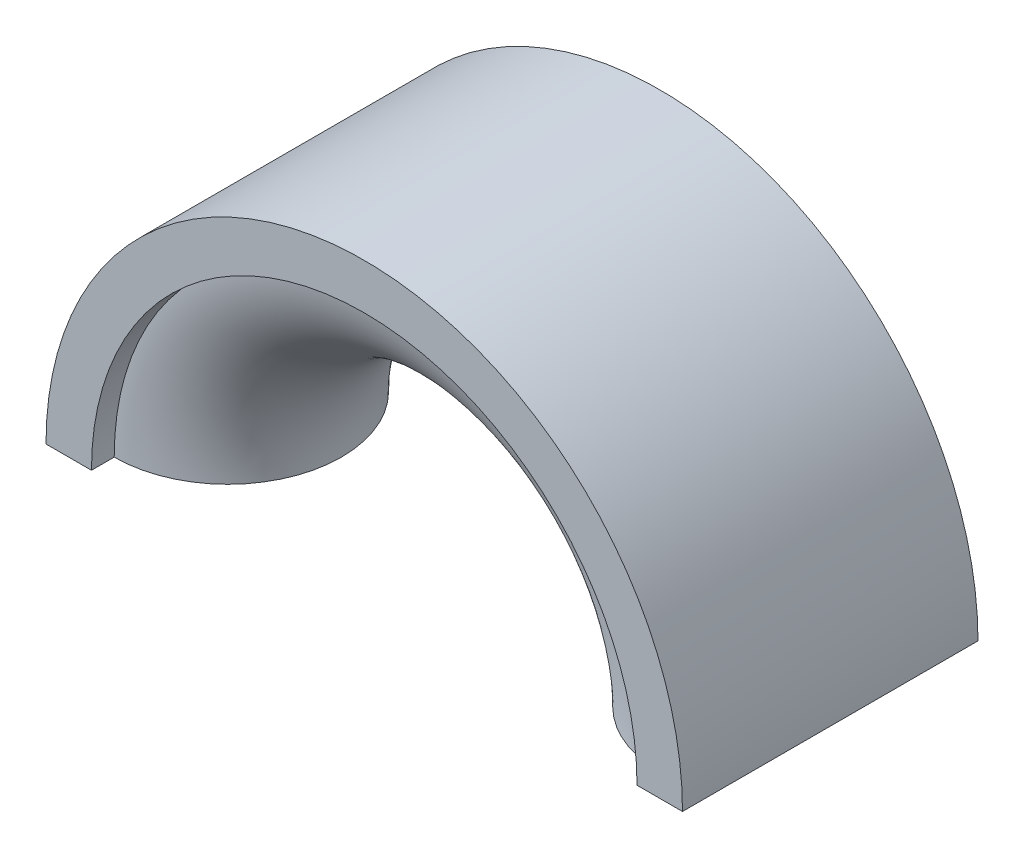
ISO-10303-21;
HEADER;
FILE_DESCRIPTION(('STEP AP214'),'2;1');
FILE_NAME('part.step','',(''),(''),'','','');
FILE_SCHEMA(('AUTOMOTIVE_DESIGN { 1 0 10303 214 1 1 1 1 }'));
ENDSEC;
DATA;
#1=APPLICATION_CONTEXT('core data for automotive mechanical design processes');
#2=APPLICATION_PROTOCOL_DEFINITION('international standard','automotive_design',2000,#1);
#3=PRODUCT_CONTEXT('',#1,'mechanical');
#4=PRODUCT('Part','Part','',(#3));
#5=PRODUCT_RELATED_PRODUCT_CATEGORY('part','',(#4));
#6=PRODUCT_DEFINITION_FORMATION('','',#4);
#7=PRODUCT_DEFINITION_CONTEXT('part definition',#1,'design');
#8=PRODUCT_DEFINITION('design','',#6,#7);
#9=PRODUCT_DEFINITION_SHAPE('','',#8);
#10=(LENGTH_UNIT() NAMED_UNIT(*) SI_UNIT(.MILLI.,.METRE.));
#11=(NAMED_UNIT(*) PLANE_ANGLE_UNIT() SI_UNIT($,.RADIAN.));
#12=(NAMED_UNIT(*) SI_UNIT($,.STERADIAN.) SOLID_ANGLE_UNIT());
#13=UNCERTAINTY_MEASURE_WITH_UNIT(LENGTH_MEASURE(1.E-05),#10,'distance_accuracy_value','');
#14=(GEOMETRIC_REPRESENTATION_CONTEXT(3) GLOBAL_UNCERTAINTY_ASSIGNED_CONTEXT((#13)) GLOBAL_UNIT_ASSIGNED_CONTEXT((#10,
#11,#12)) REPRESENTATION_CONTEXT('',''));
#15=CARTESIAN_POINT('',(0.,0.,0.));
#16=DIRECTION('',(0.,0.,1.));
#17=DIRECTION('',(1.,0.,0.));
#18=AXIS2_PLACEMENT_3D('',#15,#16,#17);
#19=CARTESIAN_POINT('',(0.,0.,0.));
#20=DIRECTION('',(0.,1.,0.));
#21=DIRECTION('',(0.,0.,1.));
#22=AXIS2_PLACEMENT_3D('',#19,#20,#21);
#23=PLANE('',#22);
#24=CARTESIAN_POINT('',(9.99999999999999,0.,5.99999999999991));
#25=DIRECTION('',(0.,-1.,0.));
#26=DIRECTION('',(0.,0.,-1.));
#27=AXIS2_PLACEMENT_3D('',#24,#25,#26);
#28=CIRCLE('',#27,1.35);
#29=CARTESIAN_POINT('',(9.99999999999999,0.,4.64999999999991));
#30=VERTEX_POINT('',#29);
#31=EDGE_CURVE('E342',#30,#30,#28,.T.);
#32=ORIENTED_EDGE('',*,*,#31,.F.);
#33=EDGE_LOOP('',(#32));
#34=FACE_BOUND('',#33,.T.);
#35=DIRECTION('',(0.,0.,-1.));
#36=VECTOR('',#35,1.);
#37=CARTESIAN_POINT('',(4.05,0.,10.));
#38=LINE('',#37,#36);
#39=CARTESIAN_POINT('',(4.05,0.,-0.999999999999999));
#40=VERTEX_POINT('',#39);
#41=CARTESIAN_POINT('',(4.05,0.,0.));
#42=VERTEX_POINT('',#41);
#43=EDGE_CURVE('E11',#40,#42,#38,.F.);
#44=ORIENTED_EDGE('',*,*,#43,.F.);
#45=DIRECTION('',(1.,0.,0.));
#46=VECTOR('',#45,1.);
#47=CARTESIAN_POINT('',(-12.,0.,-1.));
#48=LINE('',#47,#46);
#49=CARTESIAN_POINT('',(14.,0.,-1.));
#50=VERTEX_POINT('',#49);
#51=EDGE_CURVE('E68',#40,#50,#48,.T.);
#52=ORIENTED_EDGE('',*,*,#51,.T.);
#53=DIRECTION('',(0.,0.,-1.));
#54=VECTOR('',#53,1.);
#55=CARTESIAN_POINT('',(14.,0.,0.));
#56=LINE('',#55,#54);
#57=CARTESIAN_POINT('',(14.,0.,12.));
#58=VERTEX_POINT('',#57);
#59=EDGE_CURVE('E135',#50,#58,#56,.F.);
#60=ORIENTED_EDGE('',*,*,#59,.T.);
#61=DIRECTION('',(-1.,0.,0.));
#62=VECTOR('',#61,1.);
#63=CARTESIAN_POINT('',(-12.,0.,12.));
#64=LINE('',#63,#62);
#65=CARTESIAN_POINT('',(12.,0.,12.));
#66=VERTEX_POINT('',#65);
#67=EDGE_CURVE('E193',#58,#66,#64,.T.);
#68=ORIENTED_EDGE('',*,*,#67,.T.);
#69=DIRECTION('',(0.,0.,-1.));
#70=VECTOR('',#69,1.);
#71=CARTESIAN_POINT('',(12.,0.,0.));
#72=LINE('',#71,#70);
#73=CARTESIAN_POINT('',(12.0000000000001,0.,10.9999999999999));
#74=VERTEX_POINT('',#73);
#75=EDGE_CURVE('E188',#66,#74,#72,.T.);
#76=ORIENTED_EDGE('',*,*,#75,.T.);
#77=CARTESIAN_POINT('',(12.,0.,5.99999999999991));
#78=DIRECTION('',(0.,1.,0.));
#79=DIRECTION('',(0.,0.,1.));
#80=AXIS2_PLACEMENT_3D('',#77,#78,#79);
#81=CIRCLE('',#80,5.);
#82=CARTESIAN_POINT('',(12.,0.,0.999999999999957));
#83=VERTEX_POINT('',#82);
#84=EDGE_CURVE('E175',#74,#83,#81,.F.);
#85=ORIENTED_EDGE('',*,*,#84,.T.);
#86=DIRECTION('',(0.,0.,-1.));
#87=VECTOR('',#86,1.);
#88=CARTESIAN_POINT('',(12.,0.,0.));
#89=LINE('',#88,#87);
#90=CARTESIAN_POINT('',(12.,0.,0.));
#91=VERTEX_POINT('',#90);
#92=EDGE_CURVE('E167',#83,#91,#89,.T.);
#93=ORIENTED_EDGE('',*,*,#92,.T.);
#94=DIRECTION('',(-1.,0.,0.));
#95=VECTOR('',#94,1.);
#96=CARTESIAN_POINT('',(0.,0.,0.));
#97=LINE('',#96,#95);
#98=EDGE_CURVE('E162',#91,#42,#97,.T.);
#99=ORIENTED_EDGE('',*,*,#98,.T.);
#100=EDGE_LOOP('',(#44,#52,#60,#68,#76,#85,#93,#99));
#101=FACE_BOUND('',#100,.T.);
#102=ADVANCED_FACE('F45',(#34,#101),#23,.F.);
#103=CARTESIAN_POINT('',(-9.99999999999999,0.,5.99999999999991));
#104=DIRECTION('',(0.,-1.,0.));
#105=DIRECTION('',(0.,0.,-1.));
#106=AXIS2_PLACEMENT_3D('',#103,#104,#105);
#107=CIRCLE('',#106,1.35);
#108=CARTESIAN_POINT('',(-9.99999999999999,0.,4.64999999999991));
#109=VERTEX_POINT('',#108);
#110=EDGE_CURVE('E346',#109,#109,#107,.T.);
#111=ORIENTED_EDGE('',*,*,#110,.F.);
#112=EDGE_LOOP('',(#111));
#113=FACE_BOUND('',#112,.T.);
#114=DIRECTION('',(0.,0.,-1.));
#115=VECTOR('',#114,1.);
#116=CARTESIAN_POINT('',(-4.05,0.,10.));
#117=LINE('',#116,#115);
#118=CARTESIAN_POINT('',(-4.05,0.,0.));
#119=VERTEX_POINT('',#118);
#120=CARTESIAN_POINT('',(-4.05,0.,-1.));
#121=VERTEX_POINT('',#120);
#122=EDGE_CURVE('E54',#119,#121,#117,.T.);
#123=ORIENTED_EDGE('',*,*,#122,.F.);
#124=CARTESIAN_POINT('',(-12.,0.,0.));
#125=VERTEX_POINT('',#124);
#126=EDGE_CURVE('E160',#119,#125,#97,.T.);
#127=ORIENTED_EDGE('',*,*,#126,.T.);
#128=DIRECTION('',(0.,0.,-1.));
#129=VECTOR('',#128,1.);
#130=CARTESIAN_POINT('',(-12.,0.,0.));
#131=LINE('',#130,#129);
#132=CARTESIAN_POINT('',(-12.,0.,0.999999999999957));
#133=VERTEX_POINT('',#132);
#134=EDGE_CURVE('E169',#125,#133,#131,.F.);
#135=ORIENTED_EDGE('',*,*,#134,.T.);
#136=CARTESIAN_POINT('',(-12.,0.,6.00000000000008));
#137=DIRECTION('',(0.,1.,0.));
#138=DIRECTION('',(0.,0.,1.));
#139=AXIS2_PLACEMENT_3D('',#136,#137,#138);
#140=CIRCLE('',#139,5.);
#141=CARTESIAN_POINT('',(-11.9999999999999,0.,11.0000000000001));
#142=VERTEX_POINT('',#141);
#143=EDGE_CURVE('E182',#133,#142,#140,.F.);
#144=ORIENTED_EDGE('',*,*,#143,.T.);
#145=DIRECTION('',(0.,0.,-1.));
#146=VECTOR('',#145,1.);
#147=CARTESIAN_POINT('',(-12.,0.,0.));
#148=LINE('',#147,#146);
#149=CARTESIAN_POINT('',(-12.,0.,12.));
#150=VERTEX_POINT('',#149);
#151=EDGE_CURVE('E185',#142,#150,#148,.F.);
#152=ORIENTED_EDGE('',*,*,#151,.T.);
#153=CARTESIAN_POINT('',(-14.,0.,12.));
#154=VERTEX_POINT('',#153);
#155=EDGE_CURVE('E191',#150,#154,#64,.T.);
#156=ORIENTED_EDGE('',*,*,#155,.T.);
#157=DIRECTION('',(0.,0.,-1.));
#158=VECTOR('',#157,1.);
#159=CARTESIAN_POINT('',(-14.,0.,0.));
#160=LINE('',#159,#158);
#161=CARTESIAN_POINT('',(-14.,0.,-1.));
#162=VERTEX_POINT('',#161);
#163=EDGE_CURVE('E127',#154,#162,#160,.T.);
#164=ORIENTED_EDGE('',*,*,#163,.T.);
#165=EDGE_CURVE('E120',#162,#121,#48,.T.);
#166=ORIENTED_EDGE('',*,*,#165,.T.);
#167=EDGE_LOOP('',(#123,#127,#135,#144,#152,#156,#164,#166));
#168=FACE_BOUND('',#167,.T.);
#169=ADVANCED_FACE('F125',(#113,#168),#23,.F.);
#170=CARTESIAN_POINT('',(0.,0.,6.));
#171=DIRECTION('',(0.,0.,1.));
#172=DIRECTION('',(0.,-1.,0.));
#173=AXIS2_PLACEMENT_3D('',#170,#171,#172);
#174=TOROIDAL_SURFACE('',#173,12.,5.);
#175=ORIENTED_EDGE('',*,*,#143,.F.);
#176=CARTESIAN_POINT('',(0.,0.,0.999999999999999));
#177=DIRECTION('',(0.,0.,1.));
#178=DIRECTION('',(0.,-1.,0.));
#179=AXIS2_PLACEMENT_3D('',#176,#177,#178);
#180=CIRCLE('',#179,12.);
#181=EDGE_CURVE('E150',#83,#133,#180,.T.);
#182=ORIENTED_EDGE('',*,*,#181,.F.);
#183=ORIENTED_EDGE('',*,*,#84,.F.);
#184=CARTESIAN_POINT('',(0.,0.,11.));
#185=DIRECTION('',(0.,0.,-1.));
#186=DIRECTION('',(-1.,0.,0.));
#187=AXIS2_PLACEMENT_3D('',#184,#185,#186);
#188=CIRCLE('',#187,12.);
#189=EDGE_CURVE('E146',#142,#74,#188,.T.);
#190=ORIENTED_EDGE('',*,*,#189,.F.);
#191=EDGE_LOOP('',(#175,#182,#183,#190));
#192=FACE_BOUND('',#191,.T.);
#193=ADVANCED_FACE('F47',(#192),#174,.T.);
#194=CARTESIAN_POINT('',(0.,0.,0.));
#195=DIRECTION('',(0.,0.,-1.));
#196=DIRECTION('',(-1.,0.,0.));
#197=AXIS2_PLACEMENT_3D('',#194,#195,#196);
#198=CYLINDRICAL_SURFACE('',#197,12.);
#199=ORIENTED_EDGE('',*,*,#75,.F.);
#200=CARTESIAN_POINT('',(0.,0.,12.));
#201=DIRECTION('',(0.,0.,-1.));
#202=DIRECTION('',(-1.,0.,0.));
#203=AXIS2_PLACEMENT_3D('',#200,#201,#202);
#204=CIRCLE('',#203,12.);
#205=EDGE_CURVE('E142',#150,#66,#204,.T.);
#206=ORIENTED_EDGE('',*,*,#205,.F.);
#207=ORIENTED_EDGE('',*,*,#151,.F.);
#208=ORIENTED_EDGE('',*,*,#189,.T.);
#209=EDGE_LOOP('',(#199,#206,#207,#208));
#210=FACE_BOUND('',#209,.T.);
#211=ADVANCED_FACE('F204',(#210),#198,.F.);
#212=ORIENTED_EDGE('',*,*,#92,.F.);
#213=ORIENTED_EDGE('',*,*,#181,.T.);
#214=ORIENTED_EDGE('',*,*,#134,.F.);
#215=CARTESIAN_POINT('',(0.,0.,0.));
#216=DIRECTION('',(0.,0.,1.));
#217=DIRECTION('',(1.,0.,0.));
#218=AXIS2_PLACEMENT_3D('',#215,#216,#217);
#219=CIRCLE('',#218,12.);
#220=EDGE_CURVE('E115',#91,#125,#219,.T.);
#221=ORIENTED_EDGE('',*,*,#220,.F.);
#222=EDGE_LOOP('',(#212,#213,#214,#221));
#223=FACE_BOUND('',#222,.T.);
#224=ADVANCED_FACE('F166',(#223),#198,.F.);
#225=CARTESIAN_POINT('',(-12.,0.,12.));
#226=DIRECTION('',(0.,0.,1.));
#227=DIRECTION('',(1.,0.,0.));
#228=AXIS2_PLACEMENT_3D('',#225,#226,#227);
#229=PLANE('',#228);
#230=ORIENTED_EDGE('',*,*,#67,.F.);
#231=CARTESIAN_POINT('',(0.,0.,12.));
#232=DIRECTION('',(0.,0.,-1.));
#233=DIRECTION('',(-1.,0.,0.));
#234=AXIS2_PLACEMENT_3D('',#231,#232,#233);
#235=CIRCLE('',#234,14.);
#236=EDGE_CURVE('E133',#154,#58,#235,.T.);
#237=ORIENTED_EDGE('',*,*,#236,.F.);
#238=ORIENTED_EDGE('',*,*,#155,.F.);
#239=ORIENTED_EDGE('',*,*,#205,.T.);
#240=EDGE_LOOP('',(#230,#237,#238,#239));
#241=FACE_BOUND('',#240,.T.);
#242=ADVANCED_FACE('F208',(#241),#229,.T.);
#243=CARTESIAN_POINT('',(0.,0.,0.));
#244=DIRECTION('',(0.,0.,-1.));
#245=DIRECTION('',(-1.,0.,0.));
#246=AXIS2_PLACEMENT_3D('',#243,#244,#245);
#247=CYLINDRICAL_SURFACE('',#246,14.);
#248=ORIENTED_EDGE('',*,*,#59,.F.);
#249=CARTESIAN_POINT('',(0.,0.,-1.));
#250=DIRECTION('',(0.,0.,-1.));
#251=DIRECTION('',(-1.,0.,0.));
#252=AXIS2_PLACEMENT_3D('',#249,#250,#251);
#253=CIRCLE('',#252,14.);
#254=EDGE_CURVE('E129',#162,#50,#253,.T.);
#255=ORIENTED_EDGE('',*,*,#254,.F.);
#256=ORIENTED_EDGE('',*,*,#163,.F.);
#257=ORIENTED_EDGE('',*,*,#236,.T.);
#258=EDGE_LOOP('',(#248,#255,#256,#257));
#259=FACE_BOUND('',#258,.T.);
#260=ADVANCED_FACE('F210',(#259),#247,.T.);
#261=CARTESIAN_POINT('',(-12.,0.,-1.));
#262=DIRECTION('',(0.,0.,-1.));
#263=DIRECTION('',(-1.,0.,0.));
#264=AXIS2_PLACEMENT_3D('',#261,#262,#263);
#265=PLANE('',#264);
#266=ORIENTED_EDGE('',*,*,#51,.F.);
#267=CARTESIAN_POINT('',(0.,0.,-0.999999999999999));
#268=DIRECTION('',(0.,0.,-1.));
#269=DIRECTION('',(-1.,0.,0.));
#270=AXIS2_PLACEMENT_3D('',#267,#268,#269);
#271=CIRCLE('',#270,4.05);
#272=EDGE_CURVE('E110',#40,#121,#271,.F.);
#273=ORIENTED_EDGE('',*,*,#272,.T.);
#274=ORIENTED_EDGE('',*,*,#165,.F.);
#275=ORIENTED_EDGE('',*,*,#254,.T.);
#276=EDGE_LOOP('',(#266,#273,#274,#275));
#277=FACE_BOUND('',#276,.T.);
#278=ADVANCED_FACE('F118',(#277),#265,.T.);
#279=CARTESIAN_POINT('',(0.,0.,0.));
#280=DIRECTION('',(0.,0.,1.));
#281=DIRECTION('',(1.,0.,0.));
#282=AXIS2_PLACEMENT_3D('',#279,#280,#281);
#283=PLANE('',#282);
#284=ORIENTED_EDGE('',*,*,#126,.F.);
#285=CARTESIAN_POINT('',(0.,0.,0.));
#286=DIRECTION('',(0.,0.,1.));
#287=DIRECTION('',(1.,0.,0.));
#288=AXIS2_PLACEMENT_3D('',#285,#286,#287);
#289=CIRCLE('',#288,4.05);
#290=EDGE_CURVE('E60',#119,#42,#289,.F.);
#291=ORIENTED_EDGE('',*,*,#290,.T.);
#292=ORIENTED_EDGE('',*,*,#98,.F.);
#293=ORIENTED_EDGE('',*,*,#220,.T.);
#294=EDGE_LOOP('',(#284,#291,#292,#293));
#295=FACE_BOUND('',#294,.T.);
#296=ADVANCED_FACE('F159',(#295),#283,.T.);
#297=CARTESIAN_POINT('',(-9.99999999999999,2.,5.99999999999991));
#298=DIRECTION('',(0.,-1.,0.));
#299=DIRECTION('',(0.,0.,-1.));
#300=AXIS2_PLACEMENT_3D('',#297,#298,#299);
#301=CYLINDRICAL_SURFACE('',#300,1.35);
#302=CARTESIAN_POINT('',(-9.99999999999999,2.,5.99999999999991));
#303=DIRECTION('',(0.,-1.,0.));
#304=DIRECTION('',(0.,0.,-1.));
#305=AXIS2_PLACEMENT_3D('',#302,#303,#304);
#306=CIRCLE('',#305,1.35);
#307=CARTESIAN_POINT('',(-9.99999999999999,2.,4.64999999999991));
#308=VERTEX_POINT('',#307);
#309=EDGE_CURVE('E123',#308,#308,#306,.T.);
#310=ORIENTED_EDGE('',*,*,#309,.F.);
#311=EDGE_LOOP('',(#310));
#312=FACE_BOUND('',#311,.T.);
#313=ORIENTED_EDGE('',*,*,#110,.T.);
#314=EDGE_LOOP('',(#313));
#315=FACE_BOUND('',#314,.T.);
#316=ADVANCED_FACE('F234',(#312,#315),#301,.F.);
#317=CARTESIAN_POINT('',(-9.99999999999999,2.,5.99999999999991));
#318=DIRECTION('',(0.,-1.,0.));
#319=DIRECTION('',(0.,0.,-1.));
#320=AXIS2_PLACEMENT_3D('',#317,#318,#319);
#321=PLANE('',#320);
#322=ORIENTED_EDGE('',*,*,#309,.T.);
#323=EDGE_LOOP('',(#322));
#324=FACE_BOUND('',#323,.T.);
#325=ADVANCED_FACE('F231',(#324),#321,.T.);
#326=CARTESIAN_POINT('',(9.99999999999999,2.,5.99999999999991));
#327=DIRECTION('',(0.,-1.,0.));
#328=DIRECTION('',(0.,0.,-1.));
#329=AXIS2_PLACEMENT_3D('',#326,#327,#328);
#330=CYLINDRICAL_SURFACE('',#329,1.35);
#331=CARTESIAN_POINT('',(9.99999999999999,2.,5.99999999999991));
#332=DIRECTION('',(0.,-1.,0.));
#333=DIRECTION('',(0.,0.,-1.));
#334=AXIS2_PLACEMENT_3D('',#331,#332,#333);
#335=CIRCLE('',#334,1.35);
#336=CARTESIAN_POINT('',(9.99999999999999,2.,4.64999999999991));
#337=VERTEX_POINT('',#336);
#338=EDGE_CURVE('E338',#337,#337,#335,.T.);
#339=ORIENTED_EDGE('',*,*,#338,.F.);
#340=EDGE_LOOP('',(#339));
#341=FACE_BOUND('',#340,.T.);
#342=ORIENTED_EDGE('',*,*,#31,.T.);
#343=EDGE_LOOP('',(#342));
#344=FACE_BOUND('',#343,.T.);
#345=ADVANCED_FACE('F242',(#341,#344),#330,.F.);
#346=CARTESIAN_POINT('',(0.,2.,0.));
#347=DIRECTION('',(0.,-1.,0.));
#348=DIRECTION('',(0.,0.,-1.));
#349=AXIS2_PLACEMENT_3D('',#346,#347,#348);
#350=PLANE('',#349);
#351=ORIENTED_EDGE('',*,*,#338,.T.);
#352=EDGE_LOOP('',(#351));
#353=FACE_BOUND('',#352,.T.);
#354=ADVANCED_FACE('F249',(#353),#350,.T.);
#355=CARTESIAN_POINT('',(0.,0.,10.));
#356=DIRECTION('',(0.,0.,-1.));
#357=DIRECTION('',(-1.,0.,0.));
#358=AXIS2_PLACEMENT_3D('',#355,#356,#357);
#359=CYLINDRICAL_SURFACE('',#358,4.05);
#360=ORIENTED_EDGE('',*,*,#43,.T.);
#361=ORIENTED_EDGE('',*,*,#290,.F.);
#362=ORIENTED_EDGE('',*,*,#122,.T.);
#363=ORIENTED_EDGE('',*,*,#272,.F.);
#364=EDGE_LOOP('',(#360,#361,#362,#363));
#365=FACE_BOUND('',#364,.T.);
#366=ADVANCED_FACE('F109',(#365),#359,.F.);
#367=CLOSED_SHELL('',(#102,#169,#193,#211,#224,#242,#260,#278,#296,#316,#325,#345,#354,#366));
#368=MANIFOLD_SOLID_BREP('B2',#367);
#369=ADVANCED_BREP_SHAPE_REPRESENTATION('',(#18,#368),#14);
#370=SHAPE_DEFINITION_REPRESENTATION(#9,#369);
ENDSEC;
END-ISO-10303-21;
